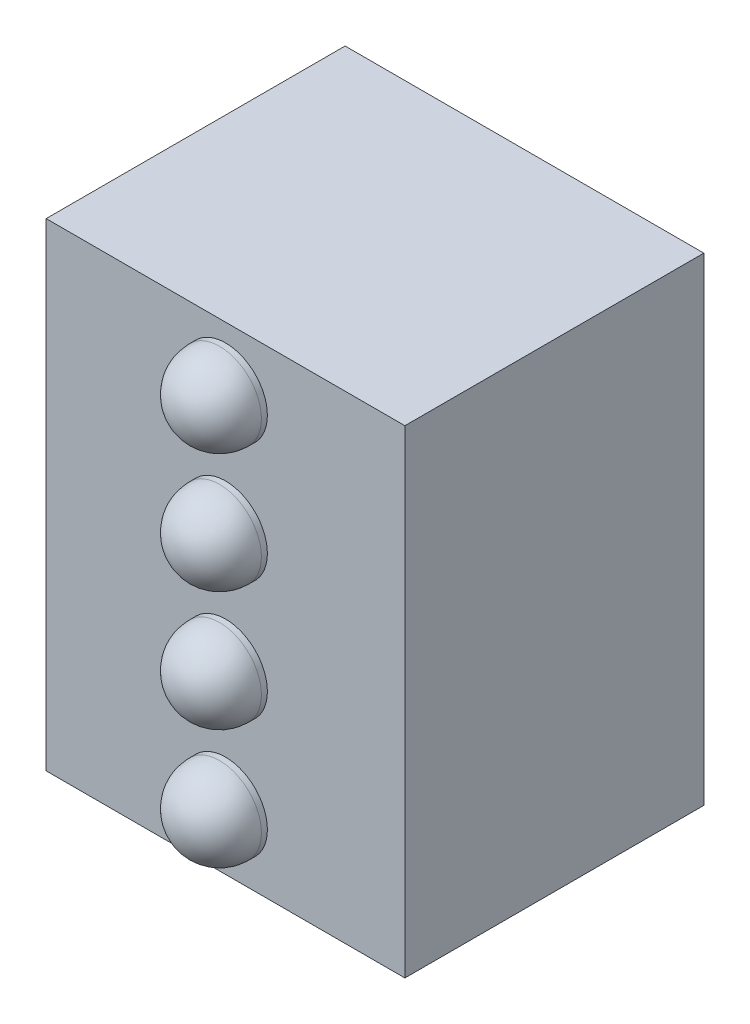
ISO-10303-21;
HEADER;
FILE_DESCRIPTION(('STEP AP214'),'2;1');
FILE_NAME('part.step','',(''),(''),'','','');
FILE_SCHEMA(('AUTOMOTIVE_DESIGN { 1 0 10303 214 1 1 1 1 }'));
ENDSEC;
DATA;
#1=APPLICATION_CONTEXT('core data for automotive mechanical design processes');
#2=APPLICATION_PROTOCOL_DEFINITION('international standard','automotive_design',2000,#1);
#3=PRODUCT_CONTEXT('',#1,'mechanical');
#4=PRODUCT('Part','Part','',(#3));
#5=PRODUCT_RELATED_PRODUCT_CATEGORY('part','',(#4));
#6=PRODUCT_DEFINITION_FORMATION('','',#4);
#7=PRODUCT_DEFINITION_CONTEXT('part definition',#1,'design');
#8=PRODUCT_DEFINITION('design','',#6,#7);
#9=PRODUCT_DEFINITION_SHAPE('','',#8);
#10=(LENGTH_UNIT() NAMED_UNIT(*) SI_UNIT(.MILLI.,.METRE.));
#11=(NAMED_UNIT(*) PLANE_ANGLE_UNIT() SI_UNIT($,.RADIAN.));
#12=(NAMED_UNIT(*) SI_UNIT($,.STERADIAN.) SOLID_ANGLE_UNIT());
#13=UNCERTAINTY_MEASURE_WITH_UNIT(LENGTH_MEASURE(1.E-05),#10,'distance_accuracy_value','');
#14=(GEOMETRIC_REPRESENTATION_CONTEXT(3) GLOBAL_UNCERTAINTY_ASSIGNED_CONTEXT((#13)) GLOBAL_UNIT_ASSIGNED_CONTEXT((#10,
#11,#12)) REPRESENTATION_CONTEXT('',''));
#15=CARTESIAN_POINT('',(0.,0.,0.));
#16=DIRECTION('',(0.,0.,1.));
#17=DIRECTION('',(1.,0.,0.));
#18=AXIS2_PLACEMENT_3D('',#15,#16,#17);
#19=CARTESIAN_POINT('',(0.,-3.81,3.302));
#20=DIRECTION('',(1.,0.,0.));
#21=DIRECTION('',(0.,1.,0.));
#22=AXIS2_PLACEMENT_3D('',#19,#20,#21);
#23=SPHERICAL_SURFACE('',#22,0.889);
#24=CARTESIAN_POINT('',(0.,-3.81,3.302));
#25=DIRECTION('',(0.,0.,1.));
#26=DIRECTION('',(1.,0.,0.));
#27=AXIS2_PLACEMENT_3D('',#24,#25,#26);
#28=CIRCLE('',#27,0.889);
#29=CARTESIAN_POINT('',(-0.889000000000002,-3.81,3.302));
#30=VERTEX_POINT('',#29);
#31=CARTESIAN_POINT('',(0.888999999999998,-3.81,3.302));
#32=VERTEX_POINT('',#31);
#33=EDGE_CURVE('E79',#30,#32,#28,.F.);
#34=ORIENTED_EDGE('',*,*,#33,.F.);
#35=CARTESIAN_POINT('',(0.,-3.81,3.302));
#36=DIRECTION('',(0.,0.,1.));
#37=DIRECTION('',(1.,0.,0.));
#38=AXIS2_PLACEMENT_3D('',#35,#36,#37);
#39=CIRCLE('',#38,0.889);
#40=EDGE_CURVE('E81',#32,#30,#39,.F.);
#41=ORIENTED_EDGE('',*,*,#40,.F.);
#42=EDGE_LOOP('',(#34,#41));
#43=FACE_BOUND('',#42,.T.);
#44=ADVANCED_FACE('F17',(#43),#23,.T.);
#45=CARTESIAN_POINT('',(0.,-1.27,3.302));
#46=DIRECTION('',(1.,0.,0.));
#47=DIRECTION('',(0.,1.,0.));
#48=AXIS2_PLACEMENT_3D('',#45,#46,#47);
#49=SPHERICAL_SURFACE('',#48,0.889);
#50=CARTESIAN_POINT('',(0.,-1.27,3.302));
#51=DIRECTION('',(0.,0.,1.));
#52=DIRECTION('',(1.,0.,0.));
#53=AXIS2_PLACEMENT_3D('',#50,#51,#52);
#54=CIRCLE('',#53,0.889);
#55=CARTESIAN_POINT('',(-0.889000000000002,-1.27,3.302));
#56=VERTEX_POINT('',#55);
#57=CARTESIAN_POINT('',(0.888999999999998,-1.27,3.302));
#58=VERTEX_POINT('',#57);
#59=EDGE_CURVE('E88',#56,#58,#54,.F.);
#60=ORIENTED_EDGE('',*,*,#59,.F.);
#61=CARTESIAN_POINT('',(0.,-1.27,3.302));
#62=DIRECTION('',(0.,0.,1.));
#63=DIRECTION('',(1.,0.,0.));
#64=AXIS2_PLACEMENT_3D('',#61,#62,#63);
#65=CIRCLE('',#64,0.889);
#66=EDGE_CURVE('E86',#58,#56,#65,.F.);
#67=ORIENTED_EDGE('',*,*,#66,.F.);
#68=EDGE_LOOP('',(#60,#67));
#69=FACE_BOUND('',#68,.T.);
#70=ADVANCED_FACE('F136',(#69),#49,.T.);
#71=CARTESIAN_POINT('',(0.,1.27,3.302));
#72=DIRECTION('',(1.,0.,0.));
#73=DIRECTION('',(0.,1.,0.));
#74=AXIS2_PLACEMENT_3D('',#71,#72,#73);
#75=SPHERICAL_SURFACE('',#74,0.889);
#76=CARTESIAN_POINT('',(0.,1.27,3.302));
#77=DIRECTION('',(0.,0.,1.));
#78=DIRECTION('',(1.,0.,0.));
#79=AXIS2_PLACEMENT_3D('',#76,#77,#78);
#80=CIRCLE('',#79,0.889);
#81=CARTESIAN_POINT('',(-0.889000000000002,1.27,3.302));
#82=VERTEX_POINT('',#81);
#83=CARTESIAN_POINT('',(0.888999999999998,1.27,3.302));
#84=VERTEX_POINT('',#83);
#85=EDGE_CURVE('E115',#82,#84,#80,.F.);
#86=ORIENTED_EDGE('',*,*,#85,.F.);
#87=CARTESIAN_POINT('',(0.,1.27,3.302));
#88=DIRECTION('',(0.,0.,1.));
#89=DIRECTION('',(1.,0.,0.));
#90=AXIS2_PLACEMENT_3D('',#87,#88,#89);
#91=CIRCLE('',#90,0.889);
#92=EDGE_CURVE('E124',#84,#82,#91,.F.);
#93=ORIENTED_EDGE('',*,*,#92,.F.);
#94=EDGE_LOOP('',(#86,#93));
#95=FACE_BOUND('',#94,.T.);
#96=ADVANCED_FACE('F131',(#95),#75,.T.);
#97=CARTESIAN_POINT('',(0.,3.81,3.302));
#98=DIRECTION('',(1.,0.,0.));
#99=DIRECTION('',(0.,1.,0.));
#100=AXIS2_PLACEMENT_3D('',#97,#98,#99);
#101=SPHERICAL_SURFACE('',#100,0.889);
#102=CARTESIAN_POINT('',(0.,3.81,3.302));
#103=DIRECTION('',(0.,0.,1.));
#104=DIRECTION('',(1.,0.,0.));
#105=AXIS2_PLACEMENT_3D('',#102,#103,#104);
#106=CIRCLE('',#105,0.889);
#107=CARTESIAN_POINT('',(-0.889000000000002,3.81,3.302));
#108=VERTEX_POINT('',#107);
#109=CARTESIAN_POINT('',(0.888999999999998,3.81,3.302));
#110=VERTEX_POINT('',#109);
#111=EDGE_CURVE('E107',#108,#110,#106,.F.);
#112=ORIENTED_EDGE('',*,*,#111,.F.);
#113=CARTESIAN_POINT('',(0.,3.81,3.302));
#114=DIRECTION('',(0.,0.,1.));
#115=DIRECTION('',(1.,0.,0.));
#116=AXIS2_PLACEMENT_3D('',#113,#114,#115);
#117=CIRCLE('',#116,0.889);
#118=EDGE_CURVE('E110',#110,#108,#117,.F.);
#119=ORIENTED_EDGE('',*,*,#118,.F.);
#120=EDGE_LOOP('',(#112,#119));
#121=FACE_BOUND('',#120,.T.);
#122=ADVANCED_FACE('F127',(#121),#101,.T.);
#123=CARTESIAN_POINT('',(0.,-3.81,3.175));
#124=DIRECTION('',(0.,0.,1.));
#125=DIRECTION('',(1.,0.,0.));
#126=AXIS2_PLACEMENT_3D('',#123,#124,#125);
#127=CYLINDRICAL_SURFACE('',#126,0.889);
#128=ORIENTED_EDGE('',*,*,#40,.T.);
#129=ORIENTED_EDGE('',*,*,#33,.T.);
#130=EDGE_LOOP('',(#128,#129));
#131=FACE_BOUND('',#130,.T.);
#132=CARTESIAN_POINT('',(0.,-3.81,3.175));
#133=DIRECTION('',(0.,0.,1.));
#134=DIRECTION('',(1.,0.,0.));
#135=AXIS2_PLACEMENT_3D('',#132,#133,#134);
#136=CIRCLE('',#135,0.889);
#137=CARTESIAN_POINT('',(0.888999999999998,-3.81,3.175));
#138=VERTEX_POINT('',#137);
#139=EDGE_CURVE('E21',#138,#138,#136,.F.);
#140=ORIENTED_EDGE('',*,*,#139,.F.);
#141=EDGE_LOOP('',(#140));
#142=FACE_BOUND('',#141,.T.);
#143=ADVANCED_FACE('F82',(#131,#142),#127,.T.);
#144=CARTESIAN_POINT('',(0.,-1.27,3.175));
#145=DIRECTION('',(0.,0.,1.));
#146=DIRECTION('',(1.,0.,0.));
#147=AXIS2_PLACEMENT_3D('',#144,#145,#146);
#148=CYLINDRICAL_SURFACE('',#147,0.889);
#149=ORIENTED_EDGE('',*,*,#66,.T.);
#150=ORIENTED_EDGE('',*,*,#59,.T.);
#151=EDGE_LOOP('',(#149,#150));
#152=FACE_BOUND('',#151,.T.);
#153=CARTESIAN_POINT('',(0.,-1.27,3.175));
#154=DIRECTION('',(0.,0.,1.));
#155=DIRECTION('',(1.,0.,0.));
#156=AXIS2_PLACEMENT_3D('',#153,#154,#155);
#157=CIRCLE('',#156,0.889);
#158=CARTESIAN_POINT('',(0.888999999999998,-1.27,3.175));
#159=VERTEX_POINT('',#158);
#160=EDGE_CURVE('E102',#159,#159,#157,.F.);
#161=ORIENTED_EDGE('',*,*,#160,.F.);
#162=EDGE_LOOP('',(#161));
#163=FACE_BOUND('',#162,.T.);
#164=ADVANCED_FACE('F160',(#152,#163),#148,.T.);
#165=CARTESIAN_POINT('',(0.,1.27,3.175));
#166=DIRECTION('',(0.,0.,1.));
#167=DIRECTION('',(1.,0.,0.));
#168=AXIS2_PLACEMENT_3D('',#165,#166,#167);
#169=CYLINDRICAL_SURFACE('',#168,0.889);
#170=ORIENTED_EDGE('',*,*,#92,.T.);
#171=ORIENTED_EDGE('',*,*,#85,.T.);
#172=EDGE_LOOP('',(#170,#171));
#173=FACE_BOUND('',#172,.T.);
#174=CARTESIAN_POINT('',(0.,1.27,3.175));
#175=DIRECTION('',(0.,0.,1.));
#176=DIRECTION('',(1.,0.,0.));
#177=AXIS2_PLACEMENT_3D('',#174,#175,#176);
#178=CIRCLE('',#177,0.889);
#179=CARTESIAN_POINT('',(0.888999999999998,1.27,3.175));
#180=VERTEX_POINT('',#179);
#181=EDGE_CURVE('E100',#180,#180,#178,.F.);
#182=ORIENTED_EDGE('',*,*,#181,.F.);
#183=EDGE_LOOP('',(#182));
#184=FACE_BOUND('',#183,.T.);
#185=ADVANCED_FACE('F156',(#173,#184),#169,.T.);
#186=CARTESIAN_POINT('',(0.,3.81,3.175));
#187=DIRECTION('',(0.,0.,1.));
#188=DIRECTION('',(1.,0.,0.));
#189=AXIS2_PLACEMENT_3D('',#186,#187,#188);
#190=CYLINDRICAL_SURFACE('',#189,0.889);
#191=ORIENTED_EDGE('',*,*,#118,.T.);
#192=ORIENTED_EDGE('',*,*,#111,.T.);
#193=EDGE_LOOP('',(#191,#192));
#194=FACE_BOUND('',#193,.T.);
#195=CARTESIAN_POINT('',(0.,3.81,3.175));
#196=DIRECTION('',(0.,0.,1.));
#197=DIRECTION('',(1.,0.,0.));
#198=AXIS2_PLACEMENT_3D('',#195,#196,#197);
#199=CIRCLE('',#198,0.889);
#200=CARTESIAN_POINT('',(0.888999999999998,3.81,3.175));
#201=VERTEX_POINT('',#200);
#202=EDGE_CURVE('E96',#201,#201,#199,.F.);
#203=ORIENTED_EDGE('',*,*,#202,.F.);
#204=EDGE_LOOP('',(#203));
#205=FACE_BOUND('',#204,.T.);
#206=ADVANCED_FACE('F159',(#194,#205),#190,.T.);
#207=CARTESIAN_POINT('',(0.,0.,3.175));
#208=DIRECTION('',(0.,0.,1.));
#209=DIRECTION('',(1.,0.,0.));
#210=AXIS2_PLACEMENT_3D('',#207,#208,#209);
#211=PLANE('',#210);
#212=ORIENTED_EDGE('',*,*,#202,.T.);
#213=EDGE_LOOP('',(#212));
#214=FACE_BOUND('',#213,.T.);
#215=ORIENTED_EDGE('',*,*,#181,.T.);
#216=EDGE_LOOP('',(#215));
#217=FACE_BOUND('',#216,.T.);
#218=ORIENTED_EDGE('',*,*,#160,.T.);
#219=EDGE_LOOP('',(#218));
#220=FACE_BOUND('',#219,.T.);
#221=ORIENTED_EDGE('',*,*,#139,.T.);
#222=EDGE_LOOP('',(#221));
#223=FACE_BOUND('',#222,.T.);
#224=DIRECTION('',(0.,1.,0.));
#225=VECTOR('',#224,1.);
#226=CARTESIAN_POINT('',(-3.81,-5.08,3.175));
#227=LINE('',#226,#225);
#228=CARTESIAN_POINT('',(-3.81,-5.08,3.175));
#229=VERTEX_POINT('',#228);
#230=CARTESIAN_POINT('',(-3.81,5.08,3.175));
#231=VERTEX_POINT('',#230);
#232=EDGE_CURVE('E173',#229,#231,#227,.T.);
#233=ORIENTED_EDGE('',*,*,#232,.F.);
#234=DIRECTION('',(1.,0.,0.));
#235=VECTOR('',#234,1.);
#236=CARTESIAN_POINT('',(3.81,-5.08,3.175));
#237=LINE('',#236,#235);
#238=CARTESIAN_POINT('',(3.81,-5.08,3.175));
#239=VERTEX_POINT('',#238);
#240=EDGE_CURVE('E99',#239,#229,#237,.F.);
#241=ORIENTED_EDGE('',*,*,#240,.F.);
#242=DIRECTION('',(0.,1.,0.));
#243=VECTOR('',#242,1.);
#244=CARTESIAN_POINT('',(3.81,5.08,3.175));
#245=LINE('',#244,#243);
#246=CARTESIAN_POINT('',(3.81,5.08,3.175));
#247=VERTEX_POINT('',#246);
#248=EDGE_CURVE('E188',#247,#239,#245,.F.);
#249=ORIENTED_EDGE('',*,*,#248,.F.);
#250=DIRECTION('',(1.,0.,0.));
#251=VECTOR('',#250,1.);
#252=CARTESIAN_POINT('',(-3.81,5.08,3.175));
#253=LINE('',#252,#251);
#254=EDGE_CURVE('E176',#231,#247,#253,.T.);
#255=ORIENTED_EDGE('',*,*,#254,.F.);
#256=EDGE_LOOP('',(#233,#241,#249,#255));
#257=FACE_BOUND('',#256,.T.);
#258=ADVANCED_FACE('F164',(#214,#217,#220,#223,#257),#211,.T.);
#259=CARTESIAN_POINT('',(3.81,-5.08,0.));
#260=DIRECTION('',(0.,-1.,0.));
#261=DIRECTION('',(0.,0.,-1.));
#262=AXIS2_PLACEMENT_3D('',#259,#260,#261);
#263=PLANE('',#262);
#264=DIRECTION('',(1.,0.,0.));
#265=VECTOR('',#264,1.);
#266=CARTESIAN_POINT('',(0.,-5.08,-3.175));
#267=LINE('',#266,#265);
#268=CARTESIAN_POINT('',(-3.81,-5.08,-3.175));
#269=VERTEX_POINT('',#268);
#270=CARTESIAN_POINT('',(3.81,-5.08,-3.175));
#271=VERTEX_POINT('',#270);
#272=EDGE_CURVE('E194',#269,#271,#267,.T.);
#273=ORIENTED_EDGE('',*,*,#272,.T.);
#274=DIRECTION('',(0.,0.,-1.));
#275=VECTOR('',#274,1.);
#276=CARTESIAN_POINT('',(3.81,-5.08,0.));
#277=LINE('',#276,#275);
#278=EDGE_CURVE('E186',#239,#271,#277,.T.);
#279=ORIENTED_EDGE('',*,*,#278,.F.);
#280=ORIENTED_EDGE('',*,*,#240,.T.);
#281=DIRECTION('',(0.,0.,1.));
#282=VECTOR('',#281,1.);
#283=CARTESIAN_POINT('',(-3.81,-5.08,0.));
#284=LINE('',#283,#282);
#285=EDGE_CURVE('E180',#269,#229,#284,.T.);
#286=ORIENTED_EDGE('',*,*,#285,.F.);
#287=EDGE_LOOP('',(#273,#279,#280,#286));
#288=FACE_BOUND('',#287,.T.);
#289=ADVANCED_FACE('F166',(#288),#263,.T.);
#290=CARTESIAN_POINT('',(3.81,5.08,0.));
#291=DIRECTION('',(1.,0.,0.));
#292=DIRECTION('',(0.,0.,-1.));
#293=AXIS2_PLACEMENT_3D('',#290,#291,#292);
#294=PLANE('',#293);
#295=DIRECTION('',(0.,1.,0.));
#296=VECTOR('',#295,1.);
#297=CARTESIAN_POINT('',(3.81,0.,-3.175));
#298=LINE('',#297,#296);
#299=CARTESIAN_POINT('',(3.81,5.08,-3.175));
#300=VERTEX_POINT('',#299);
#301=EDGE_CURVE('E195',#271,#300,#298,.T.);
#302=ORIENTED_EDGE('',*,*,#301,.T.);
#303=DIRECTION('',(0.,0.,1.));
#304=VECTOR('',#303,1.);
#305=CARTESIAN_POINT('',(3.81,5.08,0.));
#306=LINE('',#305,#304);
#307=EDGE_CURVE('E178',#247,#300,#306,.F.);
#308=ORIENTED_EDGE('',*,*,#307,.F.);
#309=ORIENTED_EDGE('',*,*,#248,.T.);
#310=ORIENTED_EDGE('',*,*,#278,.T.);
#311=EDGE_LOOP('',(#302,#308,#309,#310));
#312=FACE_BOUND('',#311,.T.);
#313=ADVANCED_FACE('F209',(#312),#294,.T.);
#314=CARTESIAN_POINT('',(-3.81,5.08,0.));
#315=DIRECTION('',(0.,1.,0.));
#316=DIRECTION('',(0.,0.,1.));
#317=AXIS2_PLACEMENT_3D('',#314,#315,#316);
#318=PLANE('',#317);
#319=DIRECTION('',(1.,0.,0.));
#320=VECTOR('',#319,1.);
#321=CARTESIAN_POINT('',(0.,5.08,-3.175));
#322=LINE('',#321,#320);
#323=CARTESIAN_POINT('',(-3.81,5.08,-3.175));
#324=VERTEX_POINT('',#323);
#325=EDGE_CURVE('E27',#300,#324,#322,.F.);
#326=ORIENTED_EDGE('',*,*,#325,.T.);
#327=DIRECTION('',(0.,0.,1.));
#328=VECTOR('',#327,1.);
#329=CARTESIAN_POINT('',(-3.81,5.08,0.));
#330=LINE('',#329,#328);
#331=EDGE_CURVE('E35',#231,#324,#330,.F.);
#332=ORIENTED_EDGE('',*,*,#331,.F.);
#333=ORIENTED_EDGE('',*,*,#254,.T.);
#334=ORIENTED_EDGE('',*,*,#307,.T.);
#335=EDGE_LOOP('',(#326,#332,#333,#334));
#336=FACE_BOUND('',#335,.T.);
#337=ADVANCED_FACE('F203',(#336),#318,.T.);
#338=CARTESIAN_POINT('',(-3.81,-5.08,0.));
#339=DIRECTION('',(-1.,0.,0.));
#340=DIRECTION('',(0.,0.,1.));
#341=AXIS2_PLACEMENT_3D('',#338,#339,#340);
#342=PLANE('',#341);
#343=DIRECTION('',(0.,1.,0.));
#344=VECTOR('',#343,1.);
#345=CARTESIAN_POINT('',(-3.81,0.,-3.175));
#346=LINE('',#345,#344);
#347=EDGE_CURVE('E11',#324,#269,#346,.F.);
#348=ORIENTED_EDGE('',*,*,#347,.T.);
#349=ORIENTED_EDGE('',*,*,#285,.T.);
#350=ORIENTED_EDGE('',*,*,#232,.T.);
#351=ORIENTED_EDGE('',*,*,#331,.T.);
#352=EDGE_LOOP('',(#348,#349,#350,#351));
#353=FACE_BOUND('',#352,.T.);
#354=ADVANCED_FACE('F193',(#353),#342,.T.);
#355=CARTESIAN_POINT('',(0.,0.,-3.175));
#356=DIRECTION('',(0.,0.,1.));
#357=DIRECTION('',(1.,0.,0.));
#358=AXIS2_PLACEMENT_3D('',#355,#356,#357);
#359=PLANE('',#358);
#360=ORIENTED_EDGE('',*,*,#325,.F.);
#361=ORIENTED_EDGE('',*,*,#301,.F.);
#362=ORIENTED_EDGE('',*,*,#272,.F.);
#363=ORIENTED_EDGE('',*,*,#347,.F.);
#364=EDGE_LOOP('',(#360,#361,#362,#363));
#365=FACE_BOUND('',#364,.T.);
#366=ADVANCED_FACE('F207',(#365),#359,.F.);
#367=CLOSED_SHELL('',(#44,#70,#96,#122,#143,#164,#185,#206,#258,#289,#313,#337,#354,#366));
#368=MANIFOLD_SOLID_BREP('B1',#367);
#369=ADVANCED_BREP_SHAPE_REPRESENTATION('',(#18,#368),#14);
#370=SHAPE_DEFINITION_REPRESENTATION(#9,#369);
ENDSEC;
END-ISO-10303-21;
